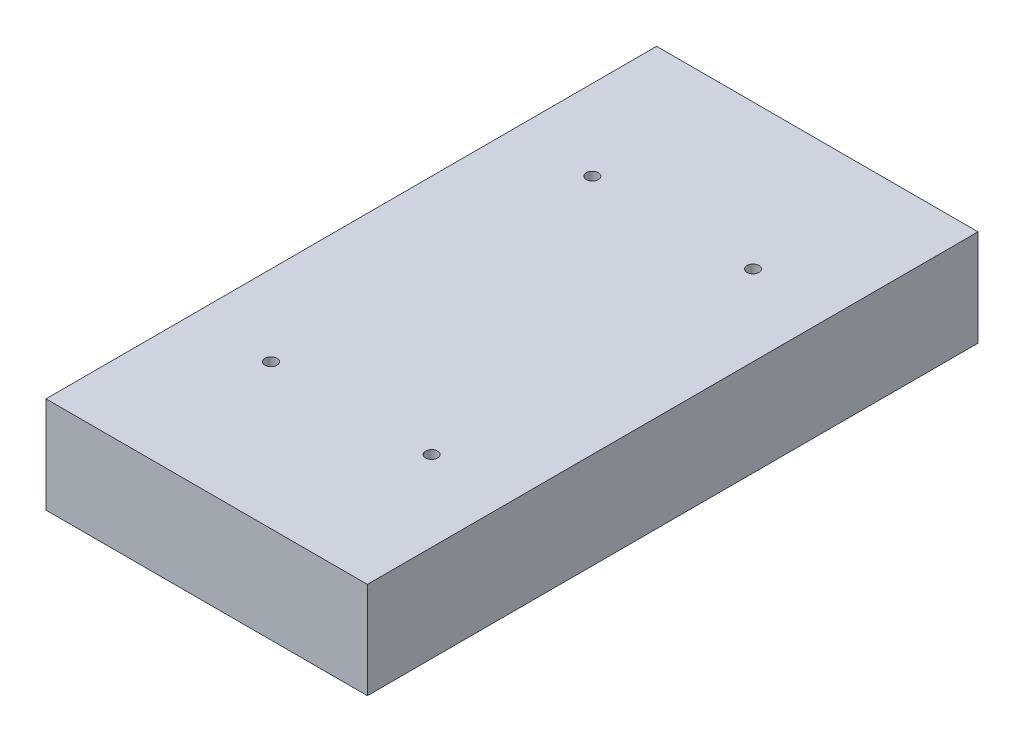
ISO-10303-21;
HEADER;
FILE_DESCRIPTION(('STEP AP214'),'2;1');
FILE_NAME('part.step','',(''),(''),'','','');
FILE_SCHEMA(('AUTOMOTIVE_DESIGN { 1 0 10303 214 1 1 1 1 }'));
ENDSEC;
DATA;
#1=APPLICATION_CONTEXT('core data for automotive mechanical design processes');
#2=APPLICATION_PROTOCOL_DEFINITION('international standard','automotive_design',2000,#1);
#3=PRODUCT_CONTEXT('',#1,'mechanical');
#4=PRODUCT('Part','Part','',(#3));
#5=PRODUCT_RELATED_PRODUCT_CATEGORY('part','',(#4));
#6=PRODUCT_DEFINITION_FORMATION('','',#4);
#7=PRODUCT_DEFINITION_CONTEXT('part definition',#1,'design');
#8=PRODUCT_DEFINITION('design','',#6,#7);
#9=PRODUCT_DEFINITION_SHAPE('','',#8);
#10=(LENGTH_UNIT() NAMED_UNIT(*) SI_UNIT(.MILLI.,.METRE.));
#11=(NAMED_UNIT(*) PLANE_ANGLE_UNIT() SI_UNIT($,.RADIAN.));
#12=(NAMED_UNIT(*) SI_UNIT($,.STERADIAN.) SOLID_ANGLE_UNIT());
#13=UNCERTAINTY_MEASURE_WITH_UNIT(LENGTH_MEASURE(1.E-05),#10,'distance_accuracy_value','');
#14=(GEOMETRIC_REPRESENTATION_CONTEXT(3) GLOBAL_UNCERTAINTY_ASSIGNED_CONTEXT((#13)) GLOBAL_UNIT_ASSIGNED_CONTEXT((#10,
#11,#12)) REPRESENTATION_CONTEXT('',''));
#15=CARTESIAN_POINT('',(0.,0.,0.));
#16=DIRECTION('',(0.,0.,1.));
#17=DIRECTION('',(1.,0.,0.));
#18=AXIS2_PLACEMENT_3D('',#15,#16,#17);
#19=CARTESIAN_POINT('',(-254.,152.4,-482.6));
#20=DIRECTION('',(0.,0.,-1.));
#21=DIRECTION('',(-1.,0.,0.));
#22=AXIS2_PLACEMENT_3D('',#19,#20,#21);
#23=PLANE('',#22);
#24=DIRECTION('',(1.,0.,0.));
#25=VECTOR('',#24,1.);
#26=CARTESIAN_POINT('',(-254.,0.,-482.6));
#27=LINE('',#26,#25);
#28=CARTESIAN_POINT('',(-254.,0.,-482.6));
#29=VERTEX_POINT('',#28);
#30=CARTESIAN_POINT('',(254.,0.,-482.6));
#31=VERTEX_POINT('',#30);
#32=EDGE_CURVE('E111',#29,#31,#27,.T.);
#33=ORIENTED_EDGE('',*,*,#32,.F.);
#34=DIRECTION('',(0.,-1.,0.));
#35=VECTOR('',#34,1.);
#36=CARTESIAN_POINT('',(-254.,152.4,-482.6));
#37=LINE('',#36,#35);
#38=CARTESIAN_POINT('',(-254.,152.4,-482.6));
#39=VERTEX_POINT('',#38);
#40=EDGE_CURVE('E11',#39,#29,#37,.T.);
#41=ORIENTED_EDGE('',*,*,#40,.F.);
#42=DIRECTION('',(1.,0.,0.));
#43=VECTOR('',#42,1.);
#44=CARTESIAN_POINT('',(-254.,152.4,-482.6));
#45=LINE('',#44,#43);
#46=CARTESIAN_POINT('',(254.,152.4,-482.6));
#47=VERTEX_POINT('',#46);
#48=EDGE_CURVE('E103',#39,#47,#45,.T.);
#49=ORIENTED_EDGE('',*,*,#48,.T.);
#50=DIRECTION('',(0.,-1.,0.));
#51=VECTOR('',#50,1.);
#52=CARTESIAN_POINT('',(254.,152.4,-482.6));
#53=LINE('',#52,#51);
#54=EDGE_CURVE('E42',#47,#31,#53,.T.);
#55=ORIENTED_EDGE('',*,*,#54,.T.);
#56=EDGE_LOOP('',(#33,#41,#49,#55));
#57=FACE_BOUND('',#56,.T.);
#58=ADVANCED_FACE('F39',(#57),#23,.T.);
#59=CARTESIAN_POINT('',(-254.,152.4,-482.6));
#60=DIRECTION('',(1.,0.,0.));
#61=DIRECTION('',(0.,0.,-1.));
#62=AXIS2_PLACEMENT_3D('',#59,#60,#61);
#63=PLANE('',#62);
#64=DIRECTION('',(0.,0.,1.));
#65=VECTOR('',#64,1.);
#66=CARTESIAN_POINT('',(-254.,0.,-482.6));
#67=LINE('',#66,#65);
#68=CARTESIAN_POINT('',(-254.,0.,482.6));
#69=VERTEX_POINT('',#68);
#70=EDGE_CURVE('E73',#29,#69,#67,.T.);
#71=ORIENTED_EDGE('',*,*,#70,.T.);
#72=DIRECTION('',(0.,-1.,0.));
#73=VECTOR('',#72,1.);
#74=CARTESIAN_POINT('',(-254.,152.4,482.6));
#75=LINE('',#74,#73);
#76=CARTESIAN_POINT('',(-254.,152.4,482.6));
#77=VERTEX_POINT('',#76);
#78=EDGE_CURVE('E49',#77,#69,#75,.T.);
#79=ORIENTED_EDGE('',*,*,#78,.F.);
#80=DIRECTION('',(0.,0.,1.));
#81=VECTOR('',#80,1.);
#82=CARTESIAN_POINT('',(-254.,152.4,-482.6));
#83=LINE('',#82,#81);
#84=EDGE_CURVE('E90',#39,#77,#83,.T.);
#85=ORIENTED_EDGE('',*,*,#84,.F.);
#86=ORIENTED_EDGE('',*,*,#40,.T.);
#87=EDGE_LOOP('',(#71,#79,#85,#86));
#88=FACE_BOUND('',#87,.T.);
#89=ADVANCED_FACE('F128',(#88),#63,.F.);
#90=CARTESIAN_POINT('',(-254.,152.4,482.6));
#91=DIRECTION('',(0.,0.,-1.));
#92=DIRECTION('',(-1.,0.,0.));
#93=AXIS2_PLACEMENT_3D('',#90,#91,#92);
#94=PLANE('',#93);
#95=DIRECTION('',(1.,0.,0.));
#96=VECTOR('',#95,1.);
#97=CARTESIAN_POINT('',(-254.,0.,482.6));
#98=LINE('',#97,#96);
#99=CARTESIAN_POINT('',(254.,0.,482.6));
#100=VERTEX_POINT('',#99);
#101=EDGE_CURVE('E98',#69,#100,#98,.T.);
#102=ORIENTED_EDGE('',*,*,#101,.T.);
#103=DIRECTION('',(0.,-1.,0.));
#104=VECTOR('',#103,1.);
#105=CARTESIAN_POINT('',(254.,152.4,482.6));
#106=LINE('',#105,#104);
#107=CARTESIAN_POINT('',(254.,152.4,482.6));
#108=VERTEX_POINT('',#107);
#109=EDGE_CURVE('E95',#108,#100,#106,.T.);
#110=ORIENTED_EDGE('',*,*,#109,.F.);
#111=DIRECTION('',(1.,0.,0.));
#112=VECTOR('',#111,1.);
#113=CARTESIAN_POINT('',(-254.,152.4,482.6));
#114=LINE('',#113,#112);
#115=EDGE_CURVE('E85',#77,#108,#114,.T.);
#116=ORIENTED_EDGE('',*,*,#115,.F.);
#117=ORIENTED_EDGE('',*,*,#78,.T.);
#118=EDGE_LOOP('',(#102,#110,#116,#117));
#119=FACE_BOUND('',#118,.T.);
#120=ADVANCED_FACE('F96',(#119),#94,.F.);
#121=CARTESIAN_POINT('',(254.,152.4,-482.6));
#122=DIRECTION('',(1.,0.,0.));
#123=DIRECTION('',(0.,0.,-1.));
#124=AXIS2_PLACEMENT_3D('',#121,#122,#123);
#125=PLANE('',#124);
#126=DIRECTION('',(0.,0.,1.));
#127=VECTOR('',#126,1.);
#128=CARTESIAN_POINT('',(254.,0.,-482.6));
#129=LINE('',#128,#127);
#130=EDGE_CURVE('E115',#31,#100,#129,.T.);
#131=ORIENTED_EDGE('',*,*,#130,.F.);
#132=ORIENTED_EDGE('',*,*,#54,.F.);
#133=DIRECTION('',(0.,0.,1.));
#134=VECTOR('',#133,1.);
#135=CARTESIAN_POINT('',(254.,152.4,-482.6));
#136=LINE('',#135,#134);
#137=EDGE_CURVE('E89',#47,#108,#136,.T.);
#138=ORIENTED_EDGE('',*,*,#137,.T.);
#139=ORIENTED_EDGE('',*,*,#109,.T.);
#140=EDGE_LOOP('',(#131,#132,#138,#139));
#141=FACE_BOUND('',#140,.T.);
#142=ADVANCED_FACE('F101',(#141),#125,.T.);
#143=CARTESIAN_POINT('',(0.,152.4,0.));
#144=DIRECTION('',(0.,-1.,0.));
#145=DIRECTION('',(0.,0.,-1.));
#146=AXIS2_PLACEMENT_3D('',#143,#144,#145);
#147=PLANE('',#146);
#148=CARTESIAN_POINT('',(-127.,152.4,-254.));
#149=DIRECTION('',(0.,1.,0.));
#150=DIRECTION('',(0.,0.,-1.));
#151=AXIS2_PLACEMENT_3D('',#148,#149,#150);
#152=CIRCLE('',#151,9.52499999999999);
#153=CARTESIAN_POINT('',(-127.,152.4,-263.525));
#154=VERTEX_POINT('',#153);
#155=EDGE_CURVE('E203',#154,#154,#152,.T.);
#156=ORIENTED_EDGE('',*,*,#155,.F.);
#157=EDGE_LOOP('',(#156));
#158=FACE_BOUND('',#157,.T.);
#159=CARTESIAN_POINT('',(127.,152.4,254.));
#160=DIRECTION('',(0.,1.,0.));
#161=DIRECTION('',(0.,0.,-1.));
#162=AXIS2_PLACEMENT_3D('',#159,#160,#161);
#163=CIRCLE('',#162,9.52499999999999);
#164=CARTESIAN_POINT('',(127.,152.4,244.475));
#165=VERTEX_POINT('',#164);
#166=EDGE_CURVE('E187',#165,#165,#163,.T.);
#167=ORIENTED_EDGE('',*,*,#166,.F.);
#168=EDGE_LOOP('',(#167));
#169=FACE_BOUND('',#168,.T.);
#170=CARTESIAN_POINT('',(-127.,152.4,254.));
#171=DIRECTION('',(0.,1.,0.));
#172=DIRECTION('',(0.,0.,1.));
#173=AXIS2_PLACEMENT_3D('',#170,#171,#172);
#174=CIRCLE('',#173,9.52499999999999);
#175=CARTESIAN_POINT('',(-127.,152.4,263.525));
#176=VERTEX_POINT('',#175);
#177=EDGE_CURVE('E188',#176,#176,#174,.T.);
#178=ORIENTED_EDGE('',*,*,#177,.F.);
#179=EDGE_LOOP('',(#178));
#180=FACE_BOUND('',#179,.T.);
#181=CARTESIAN_POINT('',(127.,152.4,-254.));
#182=DIRECTION('',(0.,1.,0.));
#183=DIRECTION('',(0.,0.,1.));
#184=AXIS2_PLACEMENT_3D('',#181,#182,#183);
#185=CIRCLE('',#184,9.52499999999999);
#186=CARTESIAN_POINT('',(127.,152.4,-244.475));
#187=VERTEX_POINT('',#186);
#188=EDGE_CURVE('E202',#187,#187,#185,.T.);
#189=ORIENTED_EDGE('',*,*,#188,.F.);
#190=EDGE_LOOP('',(#189));
#191=FACE_BOUND('',#190,.T.);
#192=ORIENTED_EDGE('',*,*,#48,.F.);
#193=ORIENTED_EDGE('',*,*,#84,.T.);
#194=ORIENTED_EDGE('',*,*,#115,.T.);
#195=ORIENTED_EDGE('',*,*,#137,.F.);
#196=EDGE_LOOP('',(#192,#193,#194,#195));
#197=FACE_BOUND('',#196,.T.);
#198=ADVANCED_FACE('F88',(#158,#169,#180,#191,#197),#147,.F.);
#199=CARTESIAN_POINT('',(0.,0.,0.));
#200=DIRECTION('',(0.,-1.,0.));
#201=DIRECTION('',(0.,0.,-1.));
#202=AXIS2_PLACEMENT_3D('',#199,#200,#201);
#203=PLANE('',#202);
#204=ORIENTED_EDGE('',*,*,#32,.T.);
#205=ORIENTED_EDGE('',*,*,#130,.T.);
#206=ORIENTED_EDGE('',*,*,#101,.F.);
#207=ORIENTED_EDGE('',*,*,#70,.F.);
#208=EDGE_LOOP('',(#204,#205,#206,#207));
#209=FACE_BOUND('',#208,.T.);
#210=ADVANCED_FACE('F125',(#209),#203,.T.);
#211=CARTESIAN_POINT('',(127.,25.4,-254.));
#212=DIRECTION('',(0.,1.,0.));
#213=DIRECTION('',(0.,0.,1.));
#214=AXIS2_PLACEMENT_3D('',#211,#212,#213);
#215=CYLINDRICAL_SURFACE('',#214,9.52499999999999);
#216=CARTESIAN_POINT('',(127.,25.4,-254.));
#217=DIRECTION('',(0.,1.,0.));
#218=DIRECTION('',(0.,0.,1.));
#219=AXIS2_PLACEMENT_3D('',#216,#217,#218);
#220=CIRCLE('',#219,9.52499999999999);
#221=CARTESIAN_POINT('',(127.,25.4,-244.475));
#222=VERTEX_POINT('',#221);
#223=EDGE_CURVE('E116',#222,#222,#220,.T.);
#224=ORIENTED_EDGE('',*,*,#223,.F.);
#225=EDGE_LOOP('',(#224));
#226=FACE_BOUND('',#225,.T.);
#227=ORIENTED_EDGE('',*,*,#188,.T.);
#228=EDGE_LOOP('',(#227));
#229=FACE_BOUND('',#228,.T.);
#230=ADVANCED_FACE('F147',(#226,#229),#215,.F.);
#231=CARTESIAN_POINT('',(127.,25.4,-254.));
#232=DIRECTION('',(0.,1.,0.));
#233=DIRECTION('',(0.,0.,1.));
#234=AXIS2_PLACEMENT_3D('',#231,#232,#233);
#235=PLANE('',#234);
#236=ORIENTED_EDGE('',*,*,#223,.T.);
#237=EDGE_LOOP('',(#236));
#238=FACE_BOUND('',#237,.T.);
#239=ADVANCED_FACE('F153',(#238),#235,.T.);
#240=CARTESIAN_POINT('',(-127.,25.4,254.));
#241=DIRECTION('',(0.,1.,0.));
#242=DIRECTION('',(0.,0.,1.));
#243=AXIS2_PLACEMENT_3D('',#240,#241,#242);
#244=CYLINDRICAL_SURFACE('',#243,9.52499999999999);
#245=CARTESIAN_POINT('',(-127.,25.4,254.));
#246=DIRECTION('',(0.,1.,0.));
#247=DIRECTION('',(0.,0.,1.));
#248=AXIS2_PLACEMENT_3D('',#245,#246,#247);
#249=CIRCLE('',#248,9.52499999999999);
#250=CARTESIAN_POINT('',(-127.,25.4,263.525));
#251=VERTEX_POINT('',#250);
#252=EDGE_CURVE('E185',#251,#251,#249,.T.);
#253=ORIENTED_EDGE('',*,*,#252,.F.);
#254=EDGE_LOOP('',(#253));
#255=FACE_BOUND('',#254,.T.);
#256=ORIENTED_EDGE('',*,*,#177,.T.);
#257=EDGE_LOOP('',(#256));
#258=FACE_BOUND('',#257,.T.);
#259=ADVANCED_FACE('F157',(#255,#258),#244,.F.);
#260=CARTESIAN_POINT('',(-127.,25.4,254.));
#261=DIRECTION('',(0.,1.,0.));
#262=DIRECTION('',(0.,0.,1.));
#263=AXIS2_PLACEMENT_3D('',#260,#261,#262);
#264=PLANE('',#263);
#265=ORIENTED_EDGE('',*,*,#252,.T.);
#266=EDGE_LOOP('',(#265));
#267=FACE_BOUND('',#266,.T.);
#268=ADVANCED_FACE('F163',(#267),#264,.T.);
#269=CARTESIAN_POINT('',(127.,25.4,254.));
#270=DIRECTION('',(0.,1.,0.));
#271=DIRECTION('',(0.,0.,1.));
#272=AXIS2_PLACEMENT_3D('',#269,#270,#271);
#273=CYLINDRICAL_SURFACE('',#272,9.52499999999999);
#274=CARTESIAN_POINT('',(127.,25.4,254.));
#275=DIRECTION('',(0.,1.,0.));
#276=DIRECTION('',(0.,0.,-1.));
#277=AXIS2_PLACEMENT_3D('',#274,#275,#276);
#278=CIRCLE('',#277,9.52499999999999);
#279=CARTESIAN_POINT('',(127.,25.4,244.475));
#280=VERTEX_POINT('',#279);
#281=EDGE_CURVE('E193',#280,#280,#278,.T.);
#282=ORIENTED_EDGE('',*,*,#281,.F.);
#283=EDGE_LOOP('',(#282));
#284=FACE_BOUND('',#283,.T.);
#285=ORIENTED_EDGE('',*,*,#166,.T.);
#286=EDGE_LOOP('',(#285));
#287=FACE_BOUND('',#286,.T.);
#288=ADVANCED_FACE('F159',(#284,#287),#273,.F.);
#289=CARTESIAN_POINT('',(127.,25.4,254.));
#290=DIRECTION('',(0.,-1.,0.));
#291=DIRECTION('',(0.,0.,-1.));
#292=AXIS2_PLACEMENT_3D('',#289,#290,#291);
#293=PLANE('',#292);
#294=ORIENTED_EDGE('',*,*,#281,.T.);
#295=EDGE_LOOP('',(#294));
#296=FACE_BOUND('',#295,.T.);
#297=ADVANCED_FACE('F162',(#296),#293,.F.);
#298=CARTESIAN_POINT('',(-127.,25.4,-254.));
#299=DIRECTION('',(0.,1.,0.));
#300=DIRECTION('',(0.,0.,1.));
#301=AXIS2_PLACEMENT_3D('',#298,#299,#300);
#302=CYLINDRICAL_SURFACE('',#301,9.52499999999999);
#303=CARTESIAN_POINT('',(-127.,25.4,-254.));
#304=DIRECTION('',(0.,1.,0.));
#305=DIRECTION('',(0.,0.,-1.));
#306=AXIS2_PLACEMENT_3D('',#303,#304,#305);
#307=CIRCLE('',#306,9.52499999999999);
#308=CARTESIAN_POINT('',(-127.,25.4,-263.525));
#309=VERTEX_POINT('',#308);
#310=EDGE_CURVE('E198',#309,#309,#307,.T.);
#311=ORIENTED_EDGE('',*,*,#310,.F.);
#312=EDGE_LOOP('',(#311));
#313=FACE_BOUND('',#312,.T.);
#314=ORIENTED_EDGE('',*,*,#155,.T.);
#315=EDGE_LOOP('',(#314));
#316=FACE_BOUND('',#315,.T.);
#317=ADVANCED_FACE('F167',(#313,#316),#302,.F.);
#318=CARTESIAN_POINT('',(-127.,25.4,-254.));
#319=DIRECTION('',(0.,-1.,0.));
#320=DIRECTION('',(0.,0.,-1.));
#321=AXIS2_PLACEMENT_3D('',#318,#319,#320);
#322=PLANE('',#321);
#323=ORIENTED_EDGE('',*,*,#310,.T.);
#324=EDGE_LOOP('',(#323));
#325=FACE_BOUND('',#324,.T.);
#326=ADVANCED_FACE('F171',(#325),#322,.F.);
#327=CLOSED_SHELL('',(#58,#89,#120,#142,#198,#210,#230,#239,#259,#268,#288,#297,#317,#326));
#328=MANIFOLD_SOLID_BREP('B2',#327);
#329=ADVANCED_BREP_SHAPE_REPRESENTATION('',(#18,#328),#14);
#330=SHAPE_DEFINITION_REPRESENTATION(#9,#329);
ENDSEC;
END-ISO-10303-21;
